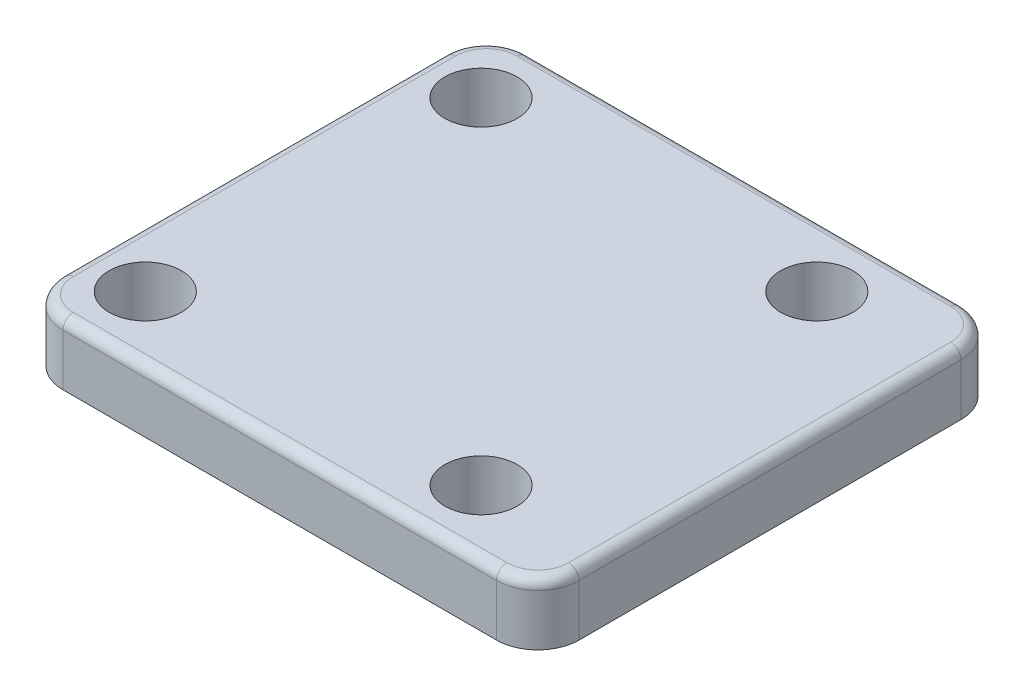
ISO-10303-21;
HEADER;
FILE_DESCRIPTION(('STEP AP214'),'2;1');
FILE_NAME('part.step','',(''),(''),'','','');
FILE_SCHEMA(('AUTOMOTIVE_DESIGN { 1 0 10303 214 1 1 1 1 }'));
ENDSEC;
DATA;
#1=APPLICATION_CONTEXT('core data for automotive mechanical design processes');
#2=APPLICATION_PROTOCOL_DEFINITION('international standard','automotive_design',2000,#1);
#3=PRODUCT_CONTEXT('',#1,'mechanical');
#4=PRODUCT('Part','Part','',(#3));
#5=PRODUCT_RELATED_PRODUCT_CATEGORY('part','',(#4));
#6=PRODUCT_DEFINITION_FORMATION('','',#4);
#7=PRODUCT_DEFINITION_CONTEXT('part definition',#1,'design');
#8=PRODUCT_DEFINITION('design','',#6,#7);
#9=PRODUCT_DEFINITION_SHAPE('','',#8);
#10=(LENGTH_UNIT() NAMED_UNIT(*) SI_UNIT(.MILLI.,.METRE.));
#11=(NAMED_UNIT(*) PLANE_ANGLE_UNIT() SI_UNIT($,.RADIAN.));
#12=(NAMED_UNIT(*) SI_UNIT($,.STERADIAN.) SOLID_ANGLE_UNIT());
#13=UNCERTAINTY_MEASURE_WITH_UNIT(LENGTH_MEASURE(1.E-05),#10,'distance_accuracy_value','');
#14=(GEOMETRIC_REPRESENTATION_CONTEXT(3) GLOBAL_UNCERTAINTY_ASSIGNED_CONTEXT((#13)) GLOBAL_UNIT_ASSIGNED_CONTEXT((#10,
#11,#12)) REPRESENTATION_CONTEXT('',''));
#15=CARTESIAN_POINT('',(0.,0.,0.));
#16=DIRECTION('',(0.,0.,1.));
#17=DIRECTION('',(1.,0.,0.));
#18=AXIS2_PLACEMENT_3D('',#15,#16,#17);
#19=CARTESIAN_POINT('',(24.,6.,18.5));
#20=DIRECTION('',(0.,-1.,0.));
#21=DIRECTION('',(0.,0.,-1.));
#22=AXIS2_PLACEMENT_3D('',#19,#20,#21);
#23=CYLINDRICAL_SURFACE('',#22,4.);
#24=DIRECTION('',(0.,-1.,0.));
#25=VECTOR('',#24,1.);
#26=CARTESIAN_POINT('',(28.,6.,18.5));
#27=LINE('',#26,#25);
#28=CARTESIAN_POINT('',(28.,5.,18.5));
#29=VERTEX_POINT('',#28);
#30=CARTESIAN_POINT('',(28.,0.,18.5));
#31=VERTEX_POINT('',#30);
#32=EDGE_CURVE('E137',#29,#31,#27,.T.);
#33=ORIENTED_EDGE('',*,*,#32,.F.);
#34=CARTESIAN_POINT('',(24.,5.,18.5));
#35=DIRECTION('',(0.,1.,0.));
#36=DIRECTION('',(0.,0.,1.));
#37=AXIS2_PLACEMENT_3D('',#34,#35,#36);
#38=CIRCLE('',#37,4.);
#39=CARTESIAN_POINT('',(24.,5.,22.5));
#40=VERTEX_POINT('',#39);
#41=EDGE_CURVE('E257',#29,#40,#38,.F.);
#42=ORIENTED_EDGE('',*,*,#41,.T.);
#43=DIRECTION('',(0.,-1.,0.));
#44=VECTOR('',#43,1.);
#45=CARTESIAN_POINT('',(24.,6.,22.5));
#46=LINE('',#45,#44);
#47=CARTESIAN_POINT('',(24.,0.,22.5));
#48=VERTEX_POINT('',#47);
#49=EDGE_CURVE('E160',#40,#48,#46,.T.);
#50=ORIENTED_EDGE('',*,*,#49,.T.);
#51=CARTESIAN_POINT('',(24.,0.,18.5));
#52=DIRECTION('',(0.,1.,0.));
#53=DIRECTION('',(0.,0.,1.));
#54=AXIS2_PLACEMENT_3D('',#51,#52,#53);
#55=CIRCLE('',#54,4.);
#56=EDGE_CURVE('E153',#48,#31,#55,.T.);
#57=ORIENTED_EDGE('',*,*,#56,.T.);
#58=EDGE_LOOP('',(#33,#42,#50,#57));
#59=FACE_BOUND('',#58,.T.);
#60=ADVANCED_FACE('F45',(#59),#23,.T.);
#61=CARTESIAN_POINT('',(28.,6.,18.5));
#62=DIRECTION('',(-1.,0.,0.));
#63=DIRECTION('',(0.,0.,1.));
#64=AXIS2_PLACEMENT_3D('',#61,#62,#63);
#65=PLANE('',#64);
#66=DIRECTION('',(0.,-1.,0.));
#67=VECTOR('',#66,1.);
#68=CARTESIAN_POINT('',(28.,6.,-18.5));
#69=LINE('',#68,#67);
#70=CARTESIAN_POINT('',(28.,5.,-18.5));
#71=VERTEX_POINT('',#70);
#72=CARTESIAN_POINT('',(28.,0.,-18.5));
#73=VERTEX_POINT('',#72);
#74=EDGE_CURVE('E147',#71,#73,#69,.T.);
#75=ORIENTED_EDGE('',*,*,#74,.F.);
#76=DIRECTION('',(0.,0.,-1.));
#77=VECTOR('',#76,1.);
#78=CARTESIAN_POINT('',(28.,5.,18.5));
#79=LINE('',#78,#77);
#80=EDGE_CURVE('E64',#71,#29,#79,.F.);
#81=ORIENTED_EDGE('',*,*,#80,.T.);
#82=ORIENTED_EDGE('',*,*,#32,.T.);
#83=DIRECTION('',(0.,0.,-1.));
#84=VECTOR('',#83,1.);
#85=CARTESIAN_POINT('',(28.,0.,18.5));
#86=LINE('',#85,#84);
#87=EDGE_CURVE('E140',#31,#73,#86,.T.);
#88=ORIENTED_EDGE('',*,*,#87,.T.);
#89=EDGE_LOOP('',(#75,#81,#82,#88));
#90=FACE_BOUND('',#89,.T.);
#91=ADVANCED_FACE('F139',(#90),#65,.F.);
#92=CARTESIAN_POINT('',(24.,6.,-18.5));
#93=DIRECTION('',(0.,-1.,0.));
#94=DIRECTION('',(0.,0.,-1.));
#95=AXIS2_PLACEMENT_3D('',#92,#93,#94);
#96=CYLINDRICAL_SURFACE('',#95,4.);
#97=DIRECTION('',(0.,-1.,0.));
#98=VECTOR('',#97,1.);
#99=CARTESIAN_POINT('',(24.,6.,-22.5));
#100=LINE('',#99,#98);
#101=CARTESIAN_POINT('',(24.,5.,-22.5));
#102=VERTEX_POINT('',#101);
#103=CARTESIAN_POINT('',(24.,0.,-22.5));
#104=VERTEX_POINT('',#103);
#105=EDGE_CURVE('E208',#102,#104,#100,.T.);
#106=ORIENTED_EDGE('',*,*,#105,.F.);
#107=CARTESIAN_POINT('',(24.,5.,-18.5));
#108=DIRECTION('',(0.,1.,0.));
#109=DIRECTION('',(0.,0.,1.));
#110=AXIS2_PLACEMENT_3D('',#107,#108,#109);
#111=CIRCLE('',#110,4.);
#112=EDGE_CURVE('E72',#102,#71,#111,.F.);
#113=ORIENTED_EDGE('',*,*,#112,.T.);
#114=ORIENTED_EDGE('',*,*,#74,.T.);
#115=CARTESIAN_POINT('',(24.,0.,-18.5));
#116=DIRECTION('',(0.,1.,0.));
#117=DIRECTION('',(0.,0.,1.));
#118=AXIS2_PLACEMENT_3D('',#115,#116,#117);
#119=CIRCLE('',#118,4.);
#120=EDGE_CURVE('E156',#73,#104,#119,.T.);
#121=ORIENTED_EDGE('',*,*,#120,.T.);
#122=EDGE_LOOP('',(#106,#113,#114,#121));
#123=FACE_BOUND('',#122,.T.);
#124=ADVANCED_FACE('F327',(#123),#96,.T.);
#125=CARTESIAN_POINT('',(24.,6.,-22.5));
#126=DIRECTION('',(0.,0.,1.));
#127=DIRECTION('',(1.,0.,0.));
#128=AXIS2_PLACEMENT_3D('',#125,#126,#127);
#129=PLANE('',#128);
#130=DIRECTION('',(0.,-1.,0.));
#131=VECTOR('',#130,1.);
#132=CARTESIAN_POINT('',(-18.,6.,-22.5));
#133=LINE('',#132,#131);
#134=CARTESIAN_POINT('',(-18.,5.,-22.5));
#135=VERTEX_POINT('',#134);
#136=CARTESIAN_POINT('',(-18.,0.,-22.5));
#137=VERTEX_POINT('',#136);
#138=EDGE_CURVE('E205',#135,#137,#133,.T.);
#139=ORIENTED_EDGE('',*,*,#138,.F.);
#140=DIRECTION('',(-1.,0.,0.));
#141=VECTOR('',#140,1.);
#142=CARTESIAN_POINT('',(24.,5.,-22.5));
#143=LINE('',#142,#141);
#144=EDGE_CURVE('E250',#135,#102,#143,.F.);
#145=ORIENTED_EDGE('',*,*,#144,.T.);
#146=ORIENTED_EDGE('',*,*,#105,.T.);
#147=DIRECTION('',(-1.,0.,0.));
#148=VECTOR('',#147,1.);
#149=CARTESIAN_POINT('',(24.,0.,-22.5));
#150=LINE('',#149,#148);
#151=EDGE_CURVE('E175',#104,#137,#150,.T.);
#152=ORIENTED_EDGE('',*,*,#151,.T.);
#153=EDGE_LOOP('',(#139,#145,#146,#152));
#154=FACE_BOUND('',#153,.T.);
#155=ADVANCED_FACE('F403',(#154),#129,.F.);
#156=CARTESIAN_POINT('',(-18.,6.,-18.5));
#157=DIRECTION('',(0.,-1.,0.));
#158=DIRECTION('',(0.,0.,-1.));
#159=AXIS2_PLACEMENT_3D('',#156,#157,#158);
#160=CYLINDRICAL_SURFACE('',#159,4.);
#161=DIRECTION('',(0.,-1.,0.));
#162=VECTOR('',#161,1.);
#163=CARTESIAN_POINT('',(-22.,6.,-18.5));
#164=LINE('',#163,#162);
#165=CARTESIAN_POINT('',(-22.,5.,-18.5));
#166=VERTEX_POINT('',#165);
#167=CARTESIAN_POINT('',(-22.,0.,-18.5));
#168=VERTEX_POINT('',#167);
#169=EDGE_CURVE('E202',#166,#168,#164,.T.);
#170=ORIENTED_EDGE('',*,*,#169,.F.);
#171=CARTESIAN_POINT('',(-18.,5.,-18.5));
#172=DIRECTION('',(0.,1.,0.));
#173=DIRECTION('',(0.,0.,1.));
#174=AXIS2_PLACEMENT_3D('',#171,#172,#173);
#175=CIRCLE('',#174,4.);
#176=EDGE_CURVE('E247',#166,#135,#175,.F.);
#177=ORIENTED_EDGE('',*,*,#176,.T.);
#178=ORIENTED_EDGE('',*,*,#138,.T.);
#179=CARTESIAN_POINT('',(-18.,0.,-18.5));
#180=DIRECTION('',(0.,1.,0.));
#181=DIRECTION('',(0.,0.,1.));
#182=AXIS2_PLACEMENT_3D('',#179,#180,#181);
#183=CIRCLE('',#182,4.);
#184=EDGE_CURVE('E179',#137,#168,#183,.T.);
#185=ORIENTED_EDGE('',*,*,#184,.T.);
#186=EDGE_LOOP('',(#170,#177,#178,#185));
#187=FACE_BOUND('',#186,.T.);
#188=ADVANCED_FACE('F401',(#187),#160,.T.);
#189=CARTESIAN_POINT('',(-22.,6.,18.5));
#190=DIRECTION('',(1.,0.,0.));
#191=DIRECTION('',(0.,0.,-1.));
#192=AXIS2_PLACEMENT_3D('',#189,#190,#191);
#193=PLANE('',#192);
#194=DIRECTION('',(0.,-1.,0.));
#195=VECTOR('',#194,1.);
#196=CARTESIAN_POINT('',(-22.,6.,18.5));
#197=LINE('',#196,#195);
#198=CARTESIAN_POINT('',(-22.,5.,18.5));
#199=VERTEX_POINT('',#198);
#200=CARTESIAN_POINT('',(-22.,0.,18.5));
#201=VERTEX_POINT('',#200);
#202=EDGE_CURVE('E199',#199,#201,#197,.T.);
#203=ORIENTED_EDGE('',*,*,#202,.F.);
#204=DIRECTION('',(0.,0.,1.));
#205=VECTOR('',#204,1.);
#206=CARTESIAN_POINT('',(-22.,5.,-18.5));
#207=LINE('',#206,#205);
#208=EDGE_CURVE('E244',#199,#166,#207,.F.);
#209=ORIENTED_EDGE('',*,*,#208,.T.);
#210=ORIENTED_EDGE('',*,*,#169,.T.);
#211=DIRECTION('',(0.,0.,1.));
#212=VECTOR('',#211,1.);
#213=CARTESIAN_POINT('',(-22.,0.,18.5));
#214=LINE('',#213,#212);
#215=EDGE_CURVE('E183',#168,#201,#214,.T.);
#216=ORIENTED_EDGE('',*,*,#215,.T.);
#217=EDGE_LOOP('',(#203,#209,#210,#216));
#218=FACE_BOUND('',#217,.T.);
#219=ADVANCED_FACE('F391',(#218),#193,.F.);
#220=CARTESIAN_POINT('',(-18.,6.,18.5));
#221=DIRECTION('',(0.,-1.,0.));
#222=DIRECTION('',(0.,0.,-1.));
#223=AXIS2_PLACEMENT_3D('',#220,#221,#222);
#224=CYLINDRICAL_SURFACE('',#223,4.);
#225=DIRECTION('',(0.,-1.,0.));
#226=VECTOR('',#225,1.);
#227=CARTESIAN_POINT('',(-18.,6.,22.5));
#228=LINE('',#227,#226);
#229=CARTESIAN_POINT('',(-18.,5.,22.5));
#230=VERTEX_POINT('',#229);
#231=CARTESIAN_POINT('',(-18.,0.,22.5));
#232=VERTEX_POINT('',#231);
#233=EDGE_CURVE('E196',#230,#232,#228,.T.);
#234=ORIENTED_EDGE('',*,*,#233,.F.);
#235=CARTESIAN_POINT('',(-18.,5.,18.5));
#236=DIRECTION('',(0.,1.,0.));
#237=DIRECTION('',(0.,0.,1.));
#238=AXIS2_PLACEMENT_3D('',#235,#236,#237);
#239=CIRCLE('',#238,4.);
#240=EDGE_CURVE('E241',#230,#199,#239,.F.);
#241=ORIENTED_EDGE('',*,*,#240,.T.);
#242=ORIENTED_EDGE('',*,*,#202,.T.);
#243=CARTESIAN_POINT('',(-18.,0.,18.5));
#244=DIRECTION('',(0.,1.,0.));
#245=DIRECTION('',(0.,0.,-1.));
#246=AXIS2_PLACEMENT_3D('',#243,#244,#245);
#247=CIRCLE('',#246,4.);
#248=EDGE_CURVE('E187',#201,#232,#247,.T.);
#249=ORIENTED_EDGE('',*,*,#248,.T.);
#250=EDGE_LOOP('',(#234,#241,#242,#249));
#251=FACE_BOUND('',#250,.T.);
#252=ADVANCED_FACE('F388',(#251),#224,.T.);
#253=CARTESIAN_POINT('',(24.,6.,22.5));
#254=DIRECTION('',(0.,0.,-1.));
#255=DIRECTION('',(-1.,0.,0.));
#256=AXIS2_PLACEMENT_3D('',#253,#254,#255);
#257=PLANE('',#256);
#258=ORIENTED_EDGE('',*,*,#49,.F.);
#259=DIRECTION('',(1.,0.,0.));
#260=VECTOR('',#259,1.);
#261=CARTESIAN_POINT('',(-18.,5.,22.5));
#262=LINE('',#261,#260);
#263=EDGE_CURVE('E237',#40,#230,#262,.F.);
#264=ORIENTED_EDGE('',*,*,#263,.T.);
#265=ORIENTED_EDGE('',*,*,#233,.T.);
#266=DIRECTION('',(1.,0.,0.));
#267=VECTOR('',#266,1.);
#268=CARTESIAN_POINT('',(24.,0.,22.5));
#269=LINE('',#268,#267);
#270=EDGE_CURVE('E191',#232,#48,#269,.T.);
#271=ORIENTED_EDGE('',*,*,#270,.T.);
#272=EDGE_LOOP('',(#258,#264,#265,#271));
#273=FACE_BOUND('',#272,.T.);
#274=ADVANCED_FACE('F379',(#273),#257,.F.);
#275=CARTESIAN_POINT('',(24.,6.,18.5));
#276=DIRECTION('',(0.,1.,0.));
#277=DIRECTION('',(0.,0.,1.));
#278=AXIS2_PLACEMENT_3D('',#275,#276,#277);
#279=PLANE('',#278);
#280=CARTESIAN_POINT('',(-16.2634559672908,6.,16.2634559672904));
#281=DIRECTION('',(0.,1.,0.));
#282=DIRECTION('',(0.,0.,1.));
#283=AXIS2_PLACEMENT_3D('',#280,#281,#282);
#284=CIRCLE('',#283,3.5);
#285=CARTESIAN_POINT('',(-16.2634559672908,6.,19.7634559672904));
#286=VERTEX_POINT('',#285);
#287=EDGE_CURVE('E456',#286,#286,#284,.T.);
#288=ORIENTED_EDGE('',*,*,#287,.F.);
#289=EDGE_LOOP('',(#288));
#290=FACE_BOUND('',#289,.T.);
#291=CARTESIAN_POINT('',(16.2634559672906,6.,16.2634559672906));
#292=DIRECTION('',(0.,1.,0.));
#293=DIRECTION('',(0.,0.,1.));
#294=AXIS2_PLACEMENT_3D('',#291,#292,#293);
#295=CIRCLE('',#294,3.50000000000014);
#296=CARTESIAN_POINT('',(16.2634559672906,6.,19.7634559672908));
#297=VERTEX_POINT('',#296);
#298=EDGE_CURVE('E451',#297,#297,#295,.T.);
#299=ORIENTED_EDGE('',*,*,#298,.F.);
#300=EDGE_LOOP('',(#299));
#301=FACE_BOUND('',#300,.T.);
#302=CARTESIAN_POINT('',(16.2634559672907,6.,-16.2634559672905));
#303=DIRECTION('',(0.,1.,0.));
#304=DIRECTION('',(0.,0.,1.));
#305=AXIS2_PLACEMENT_3D('',#302,#303,#304);
#306=CIRCLE('',#305,3.5);
#307=CARTESIAN_POINT('',(16.2634559672907,6.,-12.7634559672905));
#308=VERTEX_POINT('',#307);
#309=EDGE_CURVE('E448',#308,#308,#306,.T.);
#310=ORIENTED_EDGE('',*,*,#309,.F.);
#311=EDGE_LOOP('',(#310));
#312=FACE_BOUND('',#311,.T.);
#313=CARTESIAN_POINT('',(-16.2634559672906,6.,-16.2634559672906));
#314=DIRECTION('',(0.,1.,0.));
#315=DIRECTION('',(0.,0.,1.));
#316=AXIS2_PLACEMENT_3D('',#313,#314,#315);
#317=CIRCLE('',#316,3.5);
#318=CARTESIAN_POINT('',(-16.2634559672906,6.,-12.7634559672906));
#319=VERTEX_POINT('',#318);
#320=EDGE_CURVE('E170',#319,#319,#317,.T.);
#321=ORIENTED_EDGE('',*,*,#320,.F.);
#322=EDGE_LOOP('',(#321));
#323=FACE_BOUND('',#322,.T.);
#324=CARTESIAN_POINT('',(-18.,6.,18.5));
#325=DIRECTION('',(0.,1.,0.));
#326=DIRECTION('',(0.,0.,1.));
#327=AXIS2_PLACEMENT_3D('',#324,#325,#326);
#328=CIRCLE('',#327,3.);
#329=CARTESIAN_POINT('',(-21.,6.,18.5));
#330=VERTEX_POINT('',#329);
#331=CARTESIAN_POINT('',(-18.,6.,21.5));
#332=VERTEX_POINT('',#331);
#333=EDGE_CURVE('E230',#330,#332,#328,.T.);
#334=ORIENTED_EDGE('',*,*,#333,.T.);
#335=DIRECTION('',(1.,0.,0.));
#336=VECTOR('',#335,1.);
#337=CARTESIAN_POINT('',(24.,6.,21.5));
#338=LINE('',#337,#336);
#339=CARTESIAN_POINT('',(24.,6.,21.5));
#340=VERTEX_POINT('',#339);
#341=EDGE_CURVE('E233',#332,#340,#338,.T.);
#342=ORIENTED_EDGE('',*,*,#341,.T.);
#343=CARTESIAN_POINT('',(24.,6.,18.5));
#344=DIRECTION('',(0.,1.,0.));
#345=DIRECTION('',(0.,0.,1.));
#346=AXIS2_PLACEMENT_3D('',#343,#344,#345);
#347=CIRCLE('',#346,3.);
#348=CARTESIAN_POINT('',(27.,6.,18.5));
#349=VERTEX_POINT('',#348);
#350=EDGE_CURVE('E146',#340,#349,#347,.T.);
#351=ORIENTED_EDGE('',*,*,#350,.T.);
#352=DIRECTION('',(0.,0.,-1.));
#353=VECTOR('',#352,1.);
#354=CARTESIAN_POINT('',(27.,6.,-18.5));
#355=LINE('',#354,#353);
#356=CARTESIAN_POINT('',(27.,6.,-18.5));
#357=VERTEX_POINT('',#356);
#358=EDGE_CURVE('E215',#349,#357,#355,.T.);
#359=ORIENTED_EDGE('',*,*,#358,.T.);
#360=CARTESIAN_POINT('',(24.,6.,-18.5));
#361=DIRECTION('',(0.,1.,0.));
#362=DIRECTION('',(0.,0.,1.));
#363=AXIS2_PLACEMENT_3D('',#360,#361,#362);
#364=CIRCLE('',#363,3.);
#365=CARTESIAN_POINT('',(24.,6.,-21.5));
#366=VERTEX_POINT('',#365);
#367=EDGE_CURVE('E218',#357,#366,#364,.T.);
#368=ORIENTED_EDGE('',*,*,#367,.T.);
#369=DIRECTION('',(-1.,0.,0.));
#370=VECTOR('',#369,1.);
#371=CARTESIAN_POINT('',(-18.,6.,-21.5));
#372=LINE('',#371,#370);
#373=CARTESIAN_POINT('',(-18.,6.,-21.5));
#374=VERTEX_POINT('',#373);
#375=EDGE_CURVE('E221',#366,#374,#372,.T.);
#376=ORIENTED_EDGE('',*,*,#375,.T.);
#377=CARTESIAN_POINT('',(-18.,6.,-18.5));
#378=DIRECTION('',(0.,1.,0.));
#379=DIRECTION('',(0.,0.,1.));
#380=AXIS2_PLACEMENT_3D('',#377,#378,#379);
#381=CIRCLE('',#380,3.);
#382=CARTESIAN_POINT('',(-21.,6.,-18.5));
#383=VERTEX_POINT('',#382);
#384=EDGE_CURVE('E224',#374,#383,#381,.T.);
#385=ORIENTED_EDGE('',*,*,#384,.T.);
#386=DIRECTION('',(0.,0.,1.));
#387=VECTOR('',#386,1.);
#388=CARTESIAN_POINT('',(-21.,6.,18.5));
#389=LINE('',#388,#387);
#390=EDGE_CURVE('E227',#383,#330,#389,.T.);
#391=ORIENTED_EDGE('',*,*,#390,.T.);
#392=EDGE_LOOP('',(#334,#342,#351,#359,#368,#376,#385,#391));
#393=FACE_BOUND('',#392,.T.);
#394=ADVANCED_FACE('F365',(#290,#301,#312,#323,#393),#279,.T.);
#395=CARTESIAN_POINT('',(24.,0.,18.5));
#396=DIRECTION('',(0.,1.,0.));
#397=DIRECTION('',(0.,0.,1.));
#398=AXIS2_PLACEMENT_3D('',#395,#396,#397);
#399=PLANE('',#398);
#400=CARTESIAN_POINT('',(-16.2634559672908,0.,16.2634559672904));
#401=DIRECTION('',(0.,1.,0.));
#402=DIRECTION('',(0.,0.,1.));
#403=AXIS2_PLACEMENT_3D('',#400,#401,#402);
#404=CIRCLE('',#403,3.5);
#405=CARTESIAN_POINT('',(-16.2634559672908,0.,19.7634559672904));
#406=VERTEX_POINT('',#405);
#407=EDGE_CURVE('E50',#406,#406,#404,.T.);
#408=ORIENTED_EDGE('',*,*,#407,.T.);
#409=EDGE_LOOP('',(#408));
#410=FACE_BOUND('',#409,.T.);
#411=CARTESIAN_POINT('',(16.2634559672906,0.,16.2634559672906));
#412=DIRECTION('',(0.,1.,0.));
#413=DIRECTION('',(0.,0.,1.));
#414=AXIS2_PLACEMENT_3D('',#411,#412,#413);
#415=CIRCLE('',#414,3.50000000000014);
#416=CARTESIAN_POINT('',(16.2634559672906,0.,19.7634559672908));
#417=VERTEX_POINT('',#416);
#418=EDGE_CURVE('E299',#417,#417,#415,.T.);
#419=ORIENTED_EDGE('',*,*,#418,.T.);
#420=EDGE_LOOP('',(#419));
#421=FACE_BOUND('',#420,.T.);
#422=CARTESIAN_POINT('',(16.2634559672907,0.,-16.2634559672905));
#423=DIRECTION('',(0.,1.,0.));
#424=DIRECTION('',(0.,0.,1.));
#425=AXIS2_PLACEMENT_3D('',#422,#423,#424);
#426=CIRCLE('',#425,3.5);
#427=CARTESIAN_POINT('',(16.2634559672907,0.,-12.7634559672905));
#428=VERTEX_POINT('',#427);
#429=EDGE_CURVE('E296',#428,#428,#426,.T.);
#430=ORIENTED_EDGE('',*,*,#429,.T.);
#431=EDGE_LOOP('',(#430));
#432=FACE_BOUND('',#431,.T.);
#433=CARTESIAN_POINT('',(-16.2634559672906,0.,-16.2634559672906));
#434=DIRECTION('',(0.,1.,0.));
#435=DIRECTION('',(0.,0.,1.));
#436=AXIS2_PLACEMENT_3D('',#433,#434,#435);
#437=CIRCLE('',#436,3.5);
#438=CARTESIAN_POINT('',(-16.2634559672906,0.,-12.7634559672906));
#439=VERTEX_POINT('',#438);
#440=EDGE_CURVE('E292',#439,#439,#437,.T.);
#441=ORIENTED_EDGE('',*,*,#440,.T.);
#442=EDGE_LOOP('',(#441));
#443=FACE_BOUND('',#442,.T.);
#444=CARTESIAN_POINT('',(0.,0.,0.));
#445=DIRECTION('',(0.,1.,0.));
#446=DIRECTION('',(0.,0.,1.));
#447=AXIS2_PLACEMENT_3D('',#444,#445,#446);
#448=CIRCLE('',#447,16.);
#449=CARTESIAN_POINT('',(0.,0.,16.));
#450=VERTEX_POINT('',#449);
#451=EDGE_CURVE('E264',#450,#450,#448,.T.);
#452=ORIENTED_EDGE('',*,*,#451,.T.);
#453=EDGE_LOOP('',(#452));
#454=FACE_BOUND('',#453,.T.);
#455=ORIENTED_EDGE('',*,*,#56,.F.);
#456=ORIENTED_EDGE('',*,*,#270,.F.);
#457=ORIENTED_EDGE('',*,*,#248,.F.);
#458=ORIENTED_EDGE('',*,*,#215,.F.);
#459=ORIENTED_EDGE('',*,*,#184,.F.);
#460=ORIENTED_EDGE('',*,*,#151,.F.);
#461=ORIENTED_EDGE('',*,*,#120,.F.);
#462=ORIENTED_EDGE('',*,*,#87,.F.);
#463=EDGE_LOOP('',(#455,#456,#457,#458,#459,#460,#461,#462));
#464=FACE_BOUND('',#463,.T.);
#465=ADVANCED_FACE('F151',(#410,#421,#432,#443,#454,#464),#399,.F.);
#466=CARTESIAN_POINT('',(24.,5.,-21.5));
#467=DIRECTION('',(1.,0.,0.));
#468=DIRECTION('',(0.,0.,-1.));
#469=AXIS2_PLACEMENT_3D('',#466,#467,#468);
#470=CYLINDRICAL_SURFACE('',#469,1.);
#471=CARTESIAN_POINT('',(24.,5.,-21.5));
#472=DIRECTION('',(1.,0.,0.));
#473=DIRECTION('',(0.,0.,-1.));
#474=AXIS2_PLACEMENT_3D('',#471,#472,#473);
#475=CIRCLE('',#474,1.);
#476=EDGE_CURVE('E167',#102,#366,#475,.T.);
#477=ORIENTED_EDGE('',*,*,#476,.F.);
#478=ORIENTED_EDGE('',*,*,#144,.F.);
#479=CARTESIAN_POINT('',(-18.,5.,-21.5));
#480=DIRECTION('',(-1.,0.,0.));
#481=DIRECTION('',(0.,0.,1.));
#482=AXIS2_PLACEMENT_3D('',#479,#480,#481);
#483=CIRCLE('',#482,1.);
#484=EDGE_CURVE('E163',#374,#135,#483,.T.);
#485=ORIENTED_EDGE('',*,*,#484,.F.);
#486=ORIENTED_EDGE('',*,*,#375,.F.);
#487=EDGE_LOOP('',(#477,#478,#485,#486));
#488=FACE_BOUND('',#487,.T.);
#489=ADVANCED_FACE('F358',(#488),#470,.T.);
#490=CARTESIAN_POINT('',(-18.,5.,-18.5));
#491=DIRECTION('',(0.,1.,0.));
#492=DIRECTION('',(0.,0.,1.));
#493=AXIS2_PLACEMENT_3D('',#490,#491,#492);
#494=TOROIDAL_SURFACE('',#493,3.,1.);
#495=ORIENTED_EDGE('',*,*,#484,.T.);
#496=ORIENTED_EDGE('',*,*,#176,.F.);
#497=CARTESIAN_POINT('',(-21.,5.,-18.5));
#498=DIRECTION('',(0.,0.,1.));
#499=DIRECTION('',(1.,0.,0.));
#500=AXIS2_PLACEMENT_3D('',#497,#498,#499);
#501=CIRCLE('',#500,1.);
#502=EDGE_CURVE('E279',#383,#166,#501,.T.);
#503=ORIENTED_EDGE('',*,*,#502,.F.);
#504=ORIENTED_EDGE('',*,*,#384,.F.);
#505=EDGE_LOOP('',(#495,#496,#503,#504));
#506=FACE_BOUND('',#505,.T.);
#507=ADVANCED_FACE('F355',(#506),#494,.T.);
#508=CARTESIAN_POINT('',(24.,5.,-18.5));
#509=DIRECTION('',(0.,1.,0.));
#510=DIRECTION('',(0.,0.,1.));
#511=AXIS2_PLACEMENT_3D('',#508,#509,#510);
#512=TOROIDAL_SURFACE('',#511,3.,1.);
#513=ORIENTED_EDGE('',*,*,#476,.T.);
#514=ORIENTED_EDGE('',*,*,#367,.F.);
#515=CARTESIAN_POINT('',(27.,5.,-18.5));
#516=DIRECTION('',(0.,0.,1.));
#517=DIRECTION('',(1.,0.,0.));
#518=AXIS2_PLACEMENT_3D('',#515,#516,#517);
#519=CIRCLE('',#518,1.);
#520=EDGE_CURVE('E275',#71,#357,#519,.T.);
#521=ORIENTED_EDGE('',*,*,#520,.F.);
#522=ORIENTED_EDGE('',*,*,#112,.F.);
#523=EDGE_LOOP('',(#513,#514,#521,#522));
#524=FACE_BOUND('',#523,.T.);
#525=ADVANCED_FACE('F351',(#524),#512,.T.);
#526=CARTESIAN_POINT('',(-21.,5.,18.5));
#527=DIRECTION('',(0.,0.,-1.));
#528=DIRECTION('',(-1.,0.,0.));
#529=AXIS2_PLACEMENT_3D('',#526,#527,#528);
#530=CYLINDRICAL_SURFACE('',#529,1.);
#531=ORIENTED_EDGE('',*,*,#502,.T.);
#532=ORIENTED_EDGE('',*,*,#208,.F.);
#533=CARTESIAN_POINT('',(-21.,5.,18.5));
#534=DIRECTION('',(0.,0.,1.));
#535=DIRECTION('',(1.,0.,0.));
#536=AXIS2_PLACEMENT_3D('',#533,#534,#535);
#537=CIRCLE('',#536,1.);
#538=EDGE_CURVE('E271',#330,#199,#537,.T.);
#539=ORIENTED_EDGE('',*,*,#538,.F.);
#540=ORIENTED_EDGE('',*,*,#390,.F.);
#541=EDGE_LOOP('',(#531,#532,#539,#540));
#542=FACE_BOUND('',#541,.T.);
#543=ADVANCED_FACE('F347',(#542),#530,.T.);
#544=CARTESIAN_POINT('',(27.,5.,18.5));
#545=DIRECTION('',(0.,0.,1.));
#546=DIRECTION('',(1.,0.,0.));
#547=AXIS2_PLACEMENT_3D('',#544,#545,#546);
#548=CYLINDRICAL_SURFACE('',#547,1.);
#549=ORIENTED_EDGE('',*,*,#520,.T.);
#550=ORIENTED_EDGE('',*,*,#358,.F.);
#551=CARTESIAN_POINT('',(27.,5.,18.5));
#552=DIRECTION('',(0.,0.,1.));
#553=DIRECTION('',(1.,0.,0.));
#554=AXIS2_PLACEMENT_3D('',#551,#552,#553);
#555=CIRCLE('',#554,1.);
#556=EDGE_CURVE('E267',#29,#349,#555,.T.);
#557=ORIENTED_EDGE('',*,*,#556,.F.);
#558=ORIENTED_EDGE('',*,*,#80,.F.);
#559=EDGE_LOOP('',(#549,#550,#557,#558));
#560=FACE_BOUND('',#559,.T.);
#561=ADVANCED_FACE('F343',(#560),#548,.T.);
#562=CARTESIAN_POINT('',(-18.,5.,18.5));
#563=DIRECTION('',(0.,1.,0.));
#564=DIRECTION('',(0.,0.,1.));
#565=AXIS2_PLACEMENT_3D('',#562,#563,#564);
#566=TOROIDAL_SURFACE('',#565,3.,1.);
#567=ORIENTED_EDGE('',*,*,#538,.T.);
#568=ORIENTED_EDGE('',*,*,#240,.F.);
#569=CARTESIAN_POINT('',(-18.,5.,21.5));
#570=DIRECTION('',(1.,0.,0.));
#571=DIRECTION('',(0.,0.,-1.));
#572=AXIS2_PLACEMENT_3D('',#569,#570,#571);
#573=CIRCLE('',#572,1.);
#574=EDGE_CURVE('E263',#332,#230,#573,.T.);
#575=ORIENTED_EDGE('',*,*,#574,.F.);
#576=ORIENTED_EDGE('',*,*,#333,.F.);
#577=EDGE_LOOP('',(#567,#568,#575,#576));
#578=FACE_BOUND('',#577,.T.);
#579=ADVANCED_FACE('F339',(#578),#566,.T.);
#580=CARTESIAN_POINT('',(24.,5.,18.5));
#581=DIRECTION('',(0.,1.,0.));
#582=DIRECTION('',(0.,0.,1.));
#583=AXIS2_PLACEMENT_3D('',#580,#581,#582);
#584=TOROIDAL_SURFACE('',#583,3.,1.);
#585=ORIENTED_EDGE('',*,*,#556,.T.);
#586=ORIENTED_EDGE('',*,*,#350,.F.);
#587=CARTESIAN_POINT('',(24.,5.,21.5));
#588=DIRECTION('',(-1.,0.,0.));
#589=DIRECTION('',(0.,-1.,0.));
#590=AXIS2_PLACEMENT_3D('',#587,#588,#589);
#591=CIRCLE('',#590,1.);
#592=EDGE_CURVE('E260',#40,#340,#591,.T.);
#593=ORIENTED_EDGE('',*,*,#592,.F.);
#594=ORIENTED_EDGE('',*,*,#41,.F.);
#595=EDGE_LOOP('',(#585,#586,#593,#594));
#596=FACE_BOUND('',#595,.T.);
#597=ADVANCED_FACE('F335',(#596),#584,.T.);
#598=CARTESIAN_POINT('',(24.,5.,21.5));
#599=DIRECTION('',(-1.,0.,0.));
#600=DIRECTION('',(0.,0.,1.));
#601=AXIS2_PLACEMENT_3D('',#598,#599,#600);
#602=CYLINDRICAL_SURFACE('',#601,1.);
#603=ORIENTED_EDGE('',*,*,#574,.T.);
#604=ORIENTED_EDGE('',*,*,#263,.F.);
#605=ORIENTED_EDGE('',*,*,#592,.T.);
#606=ORIENTED_EDGE('',*,*,#341,.F.);
#607=EDGE_LOOP('',(#603,#604,#605,#606));
#608=FACE_BOUND('',#607,.T.);
#609=ADVANCED_FACE('F331',(#608),#602,.T.);
#610=CARTESIAN_POINT('',(0.,-2.,0.));
#611=DIRECTION('',(0.,1.,0.));
#612=DIRECTION('',(0.,0.,1.));
#613=AXIS2_PLACEMENT_3D('',#610,#611,#612);
#614=CYLINDRICAL_SURFACE('',#613,16.);
#615=CARTESIAN_POINT('',(0.,-0.999999999999992,0.));
#616=DIRECTION('',(0.,1.,0.));
#617=DIRECTION('',(0.,0.,1.));
#618=AXIS2_PLACEMENT_3D('',#615,#616,#617);
#619=CIRCLE('',#618,16.);
#620=CARTESIAN_POINT('',(0.,-0.999999999999992,16.));
#621=VERTEX_POINT('',#620);
#622=EDGE_CURVE('E56',#621,#621,#619,.T.);
#623=ORIENTED_EDGE('',*,*,#622,.T.);
#624=EDGE_LOOP('',(#623));
#625=FACE_BOUND('',#624,.T.);
#626=ORIENTED_EDGE('',*,*,#451,.F.);
#627=EDGE_LOOP('',(#626));
#628=FACE_BOUND('',#627,.T.);
#629=ADVANCED_FACE('F334',(#625,#628),#614,.T.);
#630=CARTESIAN_POINT('',(0.,-2.,0.));
#631=DIRECTION('',(0.,1.,0.));
#632=DIRECTION('',(0.,0.,1.));
#633=AXIS2_PLACEMENT_3D('',#630,#631,#632);
#634=PLANE('',#633);
#635=CARTESIAN_POINT('',(0.,-2.,0.));
#636=DIRECTION('',(0.,1.,0.));
#637=DIRECTION('',(0.,0.,1.));
#638=AXIS2_PLACEMENT_3D('',#635,#636,#637);
#639=CIRCLE('',#638,15.);
#640=CARTESIAN_POINT('',(0.,-2.,15.));
#641=VERTEX_POINT('',#640);
#642=EDGE_CURVE('E11',#641,#641,#639,.F.);
#643=ORIENTED_EDGE('',*,*,#642,.T.);
#644=EDGE_LOOP('',(#643));
#645=FACE_BOUND('',#644,.T.);
#646=ADVANCED_FACE('F424',(#645),#634,.F.);
#647=CARTESIAN_POINT('',(0.,-0.999999999999992,0.));
#648=DIRECTION('',(0.,1.,0.));
#649=DIRECTION('',(0.,0.,1.));
#650=AXIS2_PLACEMENT_3D('',#647,#648,#649);
#651=CONICAL_SURFACE('',#650,16.,0.785398163397448);
#652=ORIENTED_EDGE('',*,*,#642,.F.);
#653=EDGE_LOOP('',(#652));
#654=FACE_BOUND('',#653,.T.);
#655=ORIENTED_EDGE('',*,*,#622,.F.);
#656=EDGE_LOOP('',(#655));
#657=FACE_BOUND('',#656,.T.);
#658=ADVANCED_FACE('F48',(#654,#657),#651,.T.);
#659=CARTESIAN_POINT('',(-16.2634559672906,-2.,-16.2634559672906));
#660=DIRECTION('',(0.,1.,0.));
#661=DIRECTION('',(0.,0.,1.));
#662=AXIS2_PLACEMENT_3D('',#659,#660,#661);
#663=CYLINDRICAL_SURFACE('',#662,3.5);
#664=ORIENTED_EDGE('',*,*,#320,.T.);
#665=EDGE_LOOP('',(#664));
#666=FACE_BOUND('',#665,.T.);
#667=ORIENTED_EDGE('',*,*,#440,.F.);
#668=EDGE_LOOP('',(#667));
#669=FACE_BOUND('',#668,.T.);
#670=ADVANCED_FACE('F428',(#666,#669),#663,.F.);
#671=CARTESIAN_POINT('',(16.2634559672907,-2.,-16.2634559672905));
#672=DIRECTION('',(0.,1.,0.));
#673=DIRECTION('',(0.,0.,1.));
#674=AXIS2_PLACEMENT_3D('',#671,#672,#673);
#675=CYLINDRICAL_SURFACE('',#674,3.5);
#676=ORIENTED_EDGE('',*,*,#309,.T.);
#677=EDGE_LOOP('',(#676));
#678=FACE_BOUND('',#677,.T.);
#679=ORIENTED_EDGE('',*,*,#429,.F.);
#680=EDGE_LOOP('',(#679));
#681=FACE_BOUND('',#680,.T.);
#682=ADVANCED_FACE('F317',(#678,#681),#675,.F.);
#683=CARTESIAN_POINT('',(16.2634559672906,-2.,16.2634559672906));
#684=DIRECTION('',(0.,1.,0.));
#685=DIRECTION('',(0.,0.,1.));
#686=AXIS2_PLACEMENT_3D('',#683,#684,#685);
#687=CYLINDRICAL_SURFACE('',#686,3.50000000000014);
#688=ORIENTED_EDGE('',*,*,#298,.T.);
#689=EDGE_LOOP('',(#688));
#690=FACE_BOUND('',#689,.T.);
#691=ORIENTED_EDGE('',*,*,#418,.F.);
#692=EDGE_LOOP('',(#691));
#693=FACE_BOUND('',#692,.T.);
#694=ADVANCED_FACE('F311',(#690,#693),#687,.F.);
#695=CARTESIAN_POINT('',(-16.2634559672908,-2.,16.2634559672904));
#696=DIRECTION('',(0.,1.,0.));
#697=DIRECTION('',(0.,0.,1.));
#698=AXIS2_PLACEMENT_3D('',#695,#696,#697);
#699=CYLINDRICAL_SURFACE('',#698,3.5);
#700=ORIENTED_EDGE('',*,*,#287,.T.);
#701=EDGE_LOOP('',(#700));
#702=FACE_BOUND('',#701,.T.);
#703=ORIENTED_EDGE('',*,*,#407,.F.);
#704=EDGE_LOOP('',(#703));
#705=FACE_BOUND('',#704,.T.);
#706=ADVANCED_FACE('F309',(#702,#705),#699,.F.);
#707=CLOSED_SHELL('',(#60,#91,#124,#155,#188,#219,#252,#274,#394,#465,#489,#507,#525,#543,#561,
#579,#597,#609,#629,#646,#658,#670,#682,#694,#706));
#708=MANIFOLD_SOLID_BREP('B2',#707);
#709=ADVANCED_BREP_SHAPE_REPRESENTATION('',(#18,#708),#14);
#710=SHAPE_DEFINITION_REPRESENTATION(#9,#709);
ENDSEC;
END-ISO-10303-21;
